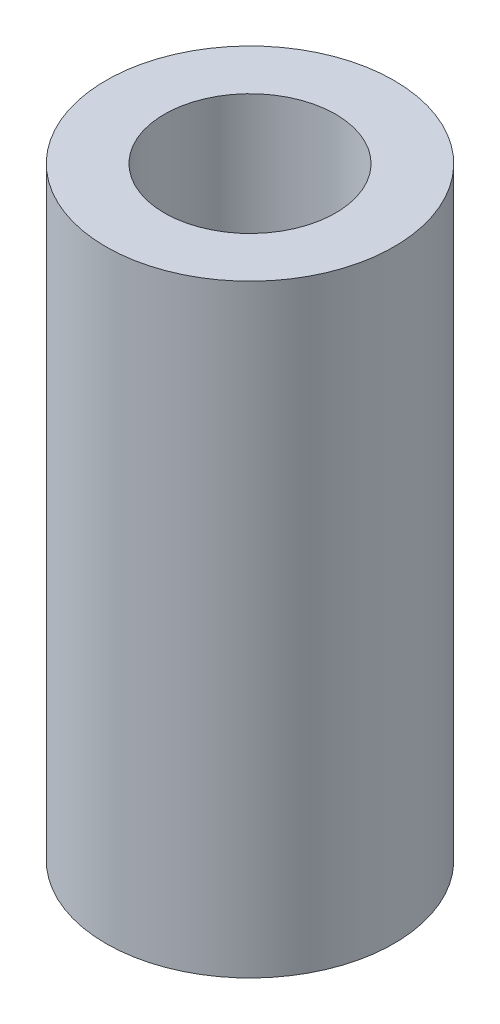
ISO-10303-21;
HEADER;
FILE_DESCRIPTION(('STEP AP214'),'2;1');
FILE_NAME('part.step','',(''),(''),'','','');
FILE_SCHEMA(('AUTOMOTIVE_DESIGN { 1 0 10303 214 1 1 1 1 }'));
ENDSEC;
DATA;
#1=APPLICATION_CONTEXT('core data for automotive mechanical design processes');
#2=APPLICATION_PROTOCOL_DEFINITION('international standard','automotive_design',2000,#1);
#3=PRODUCT_CONTEXT('',#1,'mechanical');
#4=PRODUCT('Part','Part','',(#3));
#5=PRODUCT_RELATED_PRODUCT_CATEGORY('part','',(#4));
#6=PRODUCT_DEFINITION_FORMATION('','',#4);
#7=PRODUCT_DEFINITION_CONTEXT('part definition',#1,'design');
#8=PRODUCT_DEFINITION('design','',#6,#7);
#9=PRODUCT_DEFINITION_SHAPE('','',#8);
#10=(LENGTH_UNIT() NAMED_UNIT(*) SI_UNIT(.MILLI.,.METRE.));
#11=(NAMED_UNIT(*) PLANE_ANGLE_UNIT() SI_UNIT($,.RADIAN.));
#12=(NAMED_UNIT(*) SI_UNIT($,.STERADIAN.) SOLID_ANGLE_UNIT());
#13=UNCERTAINTY_MEASURE_WITH_UNIT(LENGTH_MEASURE(1.E-05),#10,'distance_accuracy_value','');
#14=(GEOMETRIC_REPRESENTATION_CONTEXT(3) GLOBAL_UNCERTAINTY_ASSIGNED_CONTEXT((#13)) GLOBAL_UNIT_ASSIGNED_CONTEXT((#10,
#11,#12)) REPRESENTATION_CONTEXT('',''));
#15=CARTESIAN_POINT('',(0.,0.,0.));
#16=DIRECTION('',(0.,0.,1.));
#17=DIRECTION('',(1.,0.,0.));
#18=AXIS2_PLACEMENT_3D('',#15,#16,#17);
#19=CARTESIAN_POINT('',(0.,0.,0.));
#20=DIRECTION('',(0.,1.,0.));
#21=DIRECTION('',(0.,0.,1.));
#22=AXIS2_PLACEMENT_3D('',#19,#20,#21);
#23=PLANE('',#22);
#24=CARTESIAN_POINT('',(0.,0.,0.));
#25=DIRECTION('',(0.,1.,0.));
#26=DIRECTION('',(0.,0.,1.));
#27=AXIS2_PLACEMENT_3D('',#24,#25,#26);
#28=CIRCLE('',#27,8.001);
#29=CARTESIAN_POINT('',(0.,0.,8.001));
#30=VERTEX_POINT('',#29);
#31=EDGE_CURVE('E66',#30,#30,#28,.F.);
#32=ORIENTED_EDGE('',*,*,#31,.F.);
#33=EDGE_LOOP('',(#32));
#34=FACE_BOUND('',#33,.T.);
#35=CARTESIAN_POINT('',(0.,0.,0.));
#36=DIRECTION('',(0.,1.,0.));
#37=DIRECTION('',(0.,0.,1.));
#38=AXIS2_PLACEMENT_3D('',#35,#36,#37);
#39=CIRCLE('',#38,13.462);
#40=CARTESIAN_POINT('',(0.,0.,13.462));
#41=VERTEX_POINT('',#40);
#42=EDGE_CURVE('E56',#41,#41,#39,.T.);
#43=ORIENTED_EDGE('',*,*,#42,.F.);
#44=EDGE_LOOP('',(#43));
#45=FACE_BOUND('',#44,.T.);
#46=ADVANCED_FACE('F49',(#34,#45),#23,.F.);
#47=CARTESIAN_POINT('',(0.,56.388,0.));
#48=DIRECTION('',(0.,1.,0.));
#49=DIRECTION('',(0.,0.,1.));
#50=AXIS2_PLACEMENT_3D('',#47,#48,#49);
#51=PLANE('',#50);
#52=CARTESIAN_POINT('',(0.,56.388,0.));
#53=DIRECTION('',(0.,1.,0.));
#54=DIRECTION('',(0.,0.,1.));
#55=AXIS2_PLACEMENT_3D('',#52,#53,#54);
#56=CIRCLE('',#55,8.001);
#57=CARTESIAN_POINT('',(0.,56.388,8.001));
#58=VERTEX_POINT('',#57);
#59=EDGE_CURVE('E61',#58,#58,#56,.F.);
#60=ORIENTED_EDGE('',*,*,#59,.T.);
#61=EDGE_LOOP('',(#60));
#62=FACE_BOUND('',#61,.T.);
#63=CARTESIAN_POINT('',(0.,56.388,0.));
#64=DIRECTION('',(0.,1.,0.));
#65=DIRECTION('',(0.,0.,1.));
#66=AXIS2_PLACEMENT_3D('',#63,#64,#65);
#67=CIRCLE('',#66,13.462);
#68=CARTESIAN_POINT('',(0.,56.388,13.462));
#69=VERTEX_POINT('',#68);
#70=EDGE_CURVE('E11',#69,#69,#67,.T.);
#71=ORIENTED_EDGE('',*,*,#70,.T.);
#72=EDGE_LOOP('',(#71));
#73=FACE_BOUND('',#72,.T.);
#74=ADVANCED_FACE('F78',(#62,#73),#51,.T.);
#75=CARTESIAN_POINT('',(0.,0.,0.));
#76=DIRECTION('',(0.,1.,0.));
#77=DIRECTION('',(0.,0.,1.));
#78=AXIS2_PLACEMENT_3D('',#75,#76,#77);
#79=CYLINDRICAL_SURFACE('',#78,13.462);
#80=ORIENTED_EDGE('',*,*,#70,.F.);
#81=EDGE_LOOP('',(#80));
#82=FACE_BOUND('',#81,.T.);
#83=ORIENTED_EDGE('',*,*,#42,.T.);
#84=EDGE_LOOP('',(#83));
#85=FACE_BOUND('',#84,.T.);
#86=ADVANCED_FACE('F82',(#82,#85),#79,.T.);
#87=CARTESIAN_POINT('',(0.,-4.,0.));
#88=DIRECTION('',(0.,1.,0.));
#89=DIRECTION('',(0.,0.,1.));
#90=AXIS2_PLACEMENT_3D('',#87,#88,#89);
#91=CYLINDRICAL_SURFACE('',#90,8.001);
#92=ORIENTED_EDGE('',*,*,#31,.T.);
#93=EDGE_LOOP('',(#92));
#94=FACE_BOUND('',#93,.T.);
#95=ORIENTED_EDGE('',*,*,#59,.F.);
#96=EDGE_LOOP('',(#95));
#97=FACE_BOUND('',#96,.T.);
#98=ADVANCED_FACE('F73',(#94,#97),#91,.F.);
#99=CLOSED_SHELL('',(#46,#74,#86,#98));
#100=MANIFOLD_SOLID_BREP('B2',#99);
#101=ADVANCED_BREP_SHAPE_REPRESENTATION('',(#18,#100),#14);
#102=SHAPE_DEFINITION_REPRESENTATION(#9,#101);
ENDSEC;
END-ISO-10303-21;
